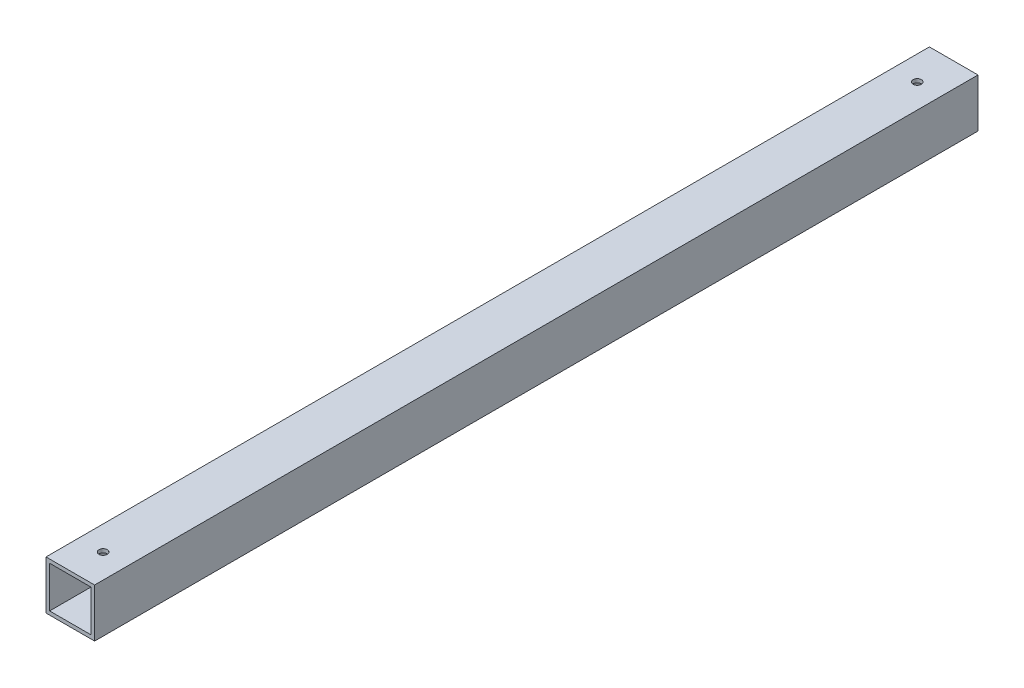
ISO-10303-21;
HEADER;
FILE_DESCRIPTION(('STEP AP214'),'2;1');
FILE_NAME('part.step','',(''),(''),'','','');
FILE_SCHEMA(('AUTOMOTIVE_DESIGN { 1 0 10303 214 1 1 1 1 }'));
ENDSEC;
DATA;
#1=APPLICATION_CONTEXT('core data for automotive mechanical design processes');
#2=APPLICATION_PROTOCOL_DEFINITION('international standard','automotive_design',2000,#1);
#3=PRODUCT_CONTEXT('',#1,'mechanical');
#4=PRODUCT('Part','Part','',(#3));
#5=PRODUCT_RELATED_PRODUCT_CATEGORY('part','',(#4));
#6=PRODUCT_DEFINITION_FORMATION('','',#4);
#7=PRODUCT_DEFINITION_CONTEXT('part definition',#1,'design');
#8=PRODUCT_DEFINITION('design','',#6,#7);
#9=PRODUCT_DEFINITION_SHAPE('','',#8);
#10=(LENGTH_UNIT() NAMED_UNIT(*) SI_UNIT(.MILLI.,.METRE.));
#11=(NAMED_UNIT(*) PLANE_ANGLE_UNIT() SI_UNIT($,.RADIAN.));
#12=(NAMED_UNIT(*) SI_UNIT($,.STERADIAN.) SOLID_ANGLE_UNIT());
#13=UNCERTAINTY_MEASURE_WITH_UNIT(LENGTH_MEASURE(1.E-05),#10,'distance_accuracy_value','');
#14=(GEOMETRIC_REPRESENTATION_CONTEXT(3) GLOBAL_UNCERTAINTY_ASSIGNED_CONTEXT((#13)) GLOBAL_UNIT_ASSIGNED_CONTEXT((#10,
#11,#12)) REPRESENTATION_CONTEXT('',''));
#15=CARTESIAN_POINT('',(0.,0.,0.));
#16=DIRECTION('',(0.,0.,1.));
#17=DIRECTION('',(1.,0.,0.));
#18=AXIS2_PLACEMENT_3D('',#15,#16,#17);
#19=CARTESIAN_POINT('',(0.,-20.,350.));
#20=DIRECTION('',(0.,1.,0.));
#21=DIRECTION('',(1.,0.,0.));
#22=AXIS2_PLACEMENT_3D('',#19,#20,#21);
#23=CYLINDRICAL_SURFACE('',#22,1.7);
#24=DIRECTION('',(0.,1.,0.));
#25=VECTOR('',#24,1.);
#26=CARTESIAN_POINT('',(1.7,-20.,350.));
#27=LINE('',#26,#25);
#28=CARTESIAN_POINT('',(1.7,8.5,350.));
#29=VERTEX_POINT('',#28);
#30=CARTESIAN_POINT('',(1.7,10.,350.));
#31=VERTEX_POINT('',#30);
#32=EDGE_CURVE('E9',#29,#31,#27,.T.);
#33=ORIENTED_EDGE('',*,*,#32,.F.);
#34=CARTESIAN_POINT('',(0.,8.5,350.));
#35=DIRECTION('',(0.,1.,0.));
#36=DIRECTION('',(1.,0.,0.));
#37=AXIS2_PLACEMENT_3D('',#34,#35,#36);
#38=CIRCLE('',#37,1.7);
#39=EDGE_CURVE('E193',#29,#29,#38,.T.);
#40=ORIENTED_EDGE('',*,*,#39,.F.);
#41=ORIENTED_EDGE('',*,*,#32,.T.);
#42=CARTESIAN_POINT('',(0.,10.,350.));
#43=DIRECTION('',(0.,1.,0.));
#44=DIRECTION('',(1.,0.,0.));
#45=AXIS2_PLACEMENT_3D('',#42,#43,#44);
#46=CIRCLE('',#45,1.7);
#47=EDGE_CURVE('E250',#31,#31,#46,.T.);
#48=ORIENTED_EDGE('',*,*,#47,.T.);
#49=EDGE_LOOP('',(#33,#40,#41,#48));
#50=FACE_BOUND('',#49,.T.);
#51=ADVANCED_FACE('F14',(#50),#23,.F.);
#52=CARTESIAN_POINT('',(0.,-20.,15.));
#53=DIRECTION('',(0.,1.,0.));
#54=DIRECTION('',(1.,0.,0.));
#55=AXIS2_PLACEMENT_3D('',#52,#53,#54);
#56=CYLINDRICAL_SURFACE('',#55,1.7);
#57=DIRECTION('',(0.,1.,0.));
#58=VECTOR('',#57,1.);
#59=CARTESIAN_POINT('',(1.7,-20.,15.));
#60=LINE('',#59,#58);
#61=CARTESIAN_POINT('',(1.7,8.5,15.));
#62=VERTEX_POINT('',#61);
#63=CARTESIAN_POINT('',(1.7,10.,15.));
#64=VERTEX_POINT('',#63);
#65=EDGE_CURVE('E25',#62,#64,#60,.T.);
#66=ORIENTED_EDGE('',*,*,#65,.F.);
#67=CARTESIAN_POINT('',(0.,8.5,15.));
#68=DIRECTION('',(0.,1.,0.));
#69=DIRECTION('',(1.,0.,0.));
#70=AXIS2_PLACEMENT_3D('',#67,#68,#69);
#71=CIRCLE('',#70,1.7);
#72=EDGE_CURVE('E200',#62,#62,#71,.T.);
#73=ORIENTED_EDGE('',*,*,#72,.F.);
#74=ORIENTED_EDGE('',*,*,#65,.T.);
#75=CARTESIAN_POINT('',(0.,10.,15.));
#76=DIRECTION('',(0.,1.,0.));
#77=DIRECTION('',(1.,0.,0.));
#78=AXIS2_PLACEMENT_3D('',#75,#76,#77);
#79=CIRCLE('',#78,1.7);
#80=EDGE_CURVE('E213',#64,#64,#79,.T.);
#81=ORIENTED_EDGE('',*,*,#80,.T.);
#82=EDGE_LOOP('',(#66,#73,#74,#81));
#83=FACE_BOUND('',#82,.T.);
#84=ADVANCED_FACE('F303',(#83),#56,.F.);
#85=CARTESIAN_POINT('',(-8.5,-8.5,-1.));
#86=DIRECTION('',(1.,0.,0.));
#87=DIRECTION('',(0.,1.,0.));
#88=AXIS2_PLACEMENT_3D('',#85,#86,#87);
#89=PLANE('',#88);
#90=DIRECTION('',(0.,0.,1.));
#91=VECTOR('',#90,1.);
#92=CARTESIAN_POINT('',(-8.5,-8.5,-1.));
#93=LINE('',#92,#91);
#94=CARTESIAN_POINT('',(-8.5,-8.5,0.));
#95=VERTEX_POINT('',#94);
#96=CARTESIAN_POINT('',(-8.5,-8.5,363.5));
#97=VERTEX_POINT('',#96);
#98=EDGE_CURVE('E157',#95,#97,#93,.T.);
#99=ORIENTED_EDGE('',*,*,#98,.F.);
#100=DIRECTION('',(0.,1.,0.));
#101=VECTOR('',#100,1.);
#102=CARTESIAN_POINT('',(-8.5,-9.25,0.));
#103=LINE('',#102,#101);
#104=CARTESIAN_POINT('',(-8.5,8.5,0.));
#105=VERTEX_POINT('',#104);
#106=EDGE_CURVE('E174',#95,#105,#103,.T.);
#107=ORIENTED_EDGE('',*,*,#106,.T.);
#108=DIRECTION('',(0.,0.,1.));
#109=VECTOR('',#108,1.);
#110=CARTESIAN_POINT('',(-8.5,8.5,-1.));
#111=LINE('',#110,#109);
#112=CARTESIAN_POINT('',(-8.5,8.5,363.5));
#113=VERTEX_POINT('',#112);
#114=EDGE_CURVE('E207',#105,#113,#111,.T.);
#115=ORIENTED_EDGE('',*,*,#114,.T.);
#116=DIRECTION('',(0.,1.,0.));
#117=VECTOR('',#116,1.);
#118=CARTESIAN_POINT('',(-8.5,-9.25,363.5));
#119=LINE('',#118,#117);
#120=EDGE_CURVE('E182',#97,#113,#119,.T.);
#121=ORIENTED_EDGE('',*,*,#120,.F.);
#122=EDGE_LOOP('',(#99,#107,#115,#121));
#123=FACE_BOUND('',#122,.T.);
#124=ADVANCED_FACE('F308',(#123),#89,.T.);
#125=CARTESIAN_POINT('',(-8.5,8.5,-1.));
#126=DIRECTION('',(0.,1.,0.));
#127=DIRECTION('',(1.,0.,0.));
#128=AXIS2_PLACEMENT_3D('',#125,#126,#127);
#129=PLANE('',#128);
#130=ORIENTED_EDGE('',*,*,#39,.T.);
#131=EDGE_LOOP('',(#130));
#132=FACE_BOUND('',#131,.T.);
#133=ORIENTED_EDGE('',*,*,#72,.T.);
#134=EDGE_LOOP('',(#133));
#135=FACE_BOUND('',#134,.T.);
#136=DIRECTION('',(-1.,0.,0.));
#137=VECTOR('',#136,1.);
#138=CARTESIAN_POINT('',(-9.25,8.5,363.5));
#139=LINE('',#138,#137);
#140=CARTESIAN_POINT('',(8.5,8.5,363.5));
#141=VERTEX_POINT('',#140);
#142=EDGE_CURVE('E169',#141,#113,#139,.T.);
#143=ORIENTED_EDGE('',*,*,#142,.T.);
#144=ORIENTED_EDGE('',*,*,#114,.F.);
#145=DIRECTION('',(-1.,0.,0.));
#146=VECTOR('',#145,1.);
#147=CARTESIAN_POINT('',(-9.25,8.5,0.));
#148=LINE('',#147,#146);
#149=CARTESIAN_POINT('',(8.5,8.5,0.));
#150=VERTEX_POINT('',#149);
#151=EDGE_CURVE('E235',#150,#105,#148,.T.);
#152=ORIENTED_EDGE('',*,*,#151,.F.);
#153=DIRECTION('',(0.,0.,1.));
#154=VECTOR('',#153,1.);
#155=CARTESIAN_POINT('',(8.5,8.5,-1.));
#156=LINE('',#155,#154);
#157=EDGE_CURVE('E177',#150,#141,#156,.T.);
#158=ORIENTED_EDGE('',*,*,#157,.T.);
#159=EDGE_LOOP('',(#143,#144,#152,#158));
#160=FACE_BOUND('',#159,.T.);
#161=ADVANCED_FACE('F315',(#132,#135,#160),#129,.F.);
#162=CARTESIAN_POINT('',(8.5,-8.5,-1.));
#163=DIRECTION('',(1.,0.,0.));
#164=DIRECTION('',(0.,1.,0.));
#165=AXIS2_PLACEMENT_3D('',#162,#163,#164);
#166=PLANE('',#165);
#167=DIRECTION('',(0.,1.,0.));
#168=VECTOR('',#167,1.);
#169=CARTESIAN_POINT('',(8.5,-9.25,363.5));
#170=LINE('',#169,#168);
#171=CARTESIAN_POINT('',(8.5,-8.5,363.5));
#172=VERTEX_POINT('',#171);
#173=EDGE_CURVE('E164',#172,#141,#170,.T.);
#174=ORIENTED_EDGE('',*,*,#173,.T.);
#175=ORIENTED_EDGE('',*,*,#157,.F.);
#176=DIRECTION('',(0.,1.,0.));
#177=VECTOR('',#176,1.);
#178=CARTESIAN_POINT('',(8.5,-9.25,0.));
#179=LINE('',#178,#177);
#180=CARTESIAN_POINT('',(8.5,-8.5,0.));
#181=VERTEX_POINT('',#180);
#182=EDGE_CURVE('E162',#181,#150,#179,.T.);
#183=ORIENTED_EDGE('',*,*,#182,.F.);
#184=DIRECTION('',(0.,0.,1.));
#185=VECTOR('',#184,1.);
#186=CARTESIAN_POINT('',(8.5,-8.5,-1.));
#187=LINE('',#186,#185);
#188=EDGE_CURVE('E150',#181,#172,#187,.T.);
#189=ORIENTED_EDGE('',*,*,#188,.T.);
#190=EDGE_LOOP('',(#174,#175,#183,#189));
#191=FACE_BOUND('',#190,.T.);
#192=ADVANCED_FACE('F318',(#191),#166,.F.);
#193=CARTESIAN_POINT('',(-8.5,-8.5,-1.));
#194=DIRECTION('',(0.,1.,0.));
#195=DIRECTION('',(1.,0.,0.));
#196=AXIS2_PLACEMENT_3D('',#193,#194,#195);
#197=PLANE('',#196);
#198=CARTESIAN_POINT('',(0.,-8.5,350.));
#199=DIRECTION('',(0.,1.,0.));
#200=DIRECTION('',(1.,0.,0.));
#201=AXIS2_PLACEMENT_3D('',#198,#199,#200);
#202=CIRCLE('',#201,1.7);
#203=CARTESIAN_POINT('',(1.7,-8.5,350.));
#204=VERTEX_POINT('',#203);
#205=EDGE_CURVE('E143',#204,#204,#202,.T.);
#206=ORIENTED_EDGE('',*,*,#205,.F.);
#207=EDGE_LOOP('',(#206));
#208=FACE_BOUND('',#207,.T.);
#209=CARTESIAN_POINT('',(0.,-8.5,15.));
#210=DIRECTION('',(0.,1.,0.));
#211=DIRECTION('',(1.,0.,0.));
#212=AXIS2_PLACEMENT_3D('',#209,#210,#211);
#213=CIRCLE('',#212,1.7);
#214=CARTESIAN_POINT('',(1.7,-8.5,15.));
#215=VERTEX_POINT('',#214);
#216=EDGE_CURVE('E137',#215,#215,#213,.T.);
#217=ORIENTED_EDGE('',*,*,#216,.F.);
#218=EDGE_LOOP('',(#217));
#219=FACE_BOUND('',#218,.T.);
#220=ORIENTED_EDGE('',*,*,#188,.F.);
#221=DIRECTION('',(-1.,0.,0.));
#222=VECTOR('',#221,1.);
#223=CARTESIAN_POINT('',(-9.25,-8.5,0.));
#224=LINE('',#223,#222);
#225=EDGE_CURVE('E170',#181,#95,#224,.T.);
#226=ORIENTED_EDGE('',*,*,#225,.T.);
#227=ORIENTED_EDGE('',*,*,#98,.T.);
#228=DIRECTION('',(-1.,0.,0.));
#229=VECTOR('',#228,1.);
#230=CARTESIAN_POINT('',(-9.25,-8.5,363.5));
#231=LINE('',#230,#229);
#232=EDGE_CURVE('E186',#172,#97,#231,.T.);
#233=ORIENTED_EDGE('',*,*,#232,.F.);
#234=EDGE_LOOP('',(#220,#226,#227,#233));
#235=FACE_BOUND('',#234,.T.);
#236=ADVANCED_FACE('F314',(#208,#219,#235),#197,.T.);
#237=CARTESIAN_POINT('',(0.,-20.,350.));
#238=DIRECTION('',(0.,1.,0.));
#239=DIRECTION('',(1.,0.,0.));
#240=AXIS2_PLACEMENT_3D('',#237,#238,#239);
#241=CYLINDRICAL_SURFACE('',#240,1.7);
#242=DIRECTION('',(0.,1.,0.));
#243=VECTOR('',#242,1.);
#244=CARTESIAN_POINT('',(1.7,-20.,350.));
#245=LINE('',#244,#243);
#246=CARTESIAN_POINT('',(1.7,-10.,350.));
#247=VERTEX_POINT('',#246);
#248=EDGE_CURVE('E146',#247,#204,#245,.T.);
#249=ORIENTED_EDGE('',*,*,#248,.F.);
#250=CARTESIAN_POINT('',(0.,-10.,350.));
#251=DIRECTION('',(0.,1.,0.));
#252=DIRECTION('',(1.,0.,0.));
#253=AXIS2_PLACEMENT_3D('',#250,#251,#252);
#254=CIRCLE('',#253,1.7);
#255=EDGE_CURVE('E222',#247,#247,#254,.T.);
#256=ORIENTED_EDGE('',*,*,#255,.F.);
#257=ORIENTED_EDGE('',*,*,#248,.T.);
#258=ORIENTED_EDGE('',*,*,#205,.T.);
#259=EDGE_LOOP('',(#249,#256,#257,#258));
#260=FACE_BOUND('',#259,.T.);
#261=ADVANCED_FACE('F144',(#260),#241,.F.);
#262=CARTESIAN_POINT('',(0.,-20.,15.));
#263=DIRECTION('',(0.,1.,0.));
#264=DIRECTION('',(1.,0.,0.));
#265=AXIS2_PLACEMENT_3D('',#262,#263,#264);
#266=CYLINDRICAL_SURFACE('',#265,1.7);
#267=DIRECTION('',(0.,1.,0.));
#268=VECTOR('',#267,1.);
#269=CARTESIAN_POINT('',(1.7,-20.,15.));
#270=LINE('',#269,#268);
#271=CARTESIAN_POINT('',(1.7,-10.,15.));
#272=VERTEX_POINT('',#271);
#273=EDGE_CURVE('E126',#272,#215,#270,.T.);
#274=ORIENTED_EDGE('',*,*,#273,.F.);
#275=CARTESIAN_POINT('',(0.,-10.,15.));
#276=DIRECTION('',(0.,1.,0.));
#277=DIRECTION('',(1.,0.,0.));
#278=AXIS2_PLACEMENT_3D('',#275,#276,#277);
#279=CIRCLE('',#278,1.7);
#280=EDGE_CURVE('E225',#272,#272,#279,.T.);
#281=ORIENTED_EDGE('',*,*,#280,.F.);
#282=ORIENTED_EDGE('',*,*,#273,.T.);
#283=ORIENTED_EDGE('',*,*,#216,.T.);
#284=EDGE_LOOP('',(#274,#281,#282,#283));
#285=FACE_BOUND('',#284,.T.);
#286=ADVANCED_FACE('F313',(#285),#266,.F.);
#287=CARTESIAN_POINT('',(10.,-10.,0.));
#288=DIRECTION('',(1.,0.,0.));
#289=DIRECTION('',(0.,1.,0.));
#290=AXIS2_PLACEMENT_3D('',#287,#288,#289);
#291=PLANE('',#290);
#292=DIRECTION('',(0.,0.,1.));
#293=VECTOR('',#292,1.);
#294=CARTESIAN_POINT('',(10.,-10.,0.));
#295=LINE('',#294,#293);
#296=CARTESIAN_POINT('',(10.,-10.,0.));
#297=VERTEX_POINT('',#296);
#298=CARTESIAN_POINT('',(10.,-10.,363.5));
#299=VERTEX_POINT('',#298);
#300=EDGE_CURVE('E190',#297,#299,#295,.T.);
#301=ORIENTED_EDGE('',*,*,#300,.F.);
#302=DIRECTION('',(0.,1.,0.));
#303=VECTOR('',#302,1.);
#304=CARTESIAN_POINT('',(10.,-10.,0.));
#305=LINE('',#304,#303);
#306=CARTESIAN_POINT('',(10.,10.,0.));
#307=VERTEX_POINT('',#306);
#308=EDGE_CURVE('E253',#297,#307,#305,.T.);
#309=ORIENTED_EDGE('',*,*,#308,.T.);
#310=DIRECTION('',(0.,0.,1.));
#311=VECTOR('',#310,1.);
#312=CARTESIAN_POINT('',(10.,10.,0.));
#313=LINE('',#312,#311);
#314=CARTESIAN_POINT('',(10.,10.,363.5));
#315=VERTEX_POINT('',#314);
#316=EDGE_CURVE('E181',#307,#315,#313,.T.);
#317=ORIENTED_EDGE('',*,*,#316,.T.);
#318=DIRECTION('',(0.,1.,0.));
#319=VECTOR('',#318,1.);
#320=CARTESIAN_POINT('',(10.,-10.,363.5));
#321=LINE('',#320,#319);
#322=EDGE_CURVE('E114',#299,#315,#321,.T.);
#323=ORIENTED_EDGE('',*,*,#322,.F.);
#324=EDGE_LOOP('',(#301,#309,#317,#323));
#325=FACE_BOUND('',#324,.T.);
#326=ADVANCED_FACE('F279',(#325),#291,.T.);
#327=CARTESIAN_POINT('',(-10.,-10.,0.));
#328=DIRECTION('',(0.,0.,1.));
#329=DIRECTION('',(1.,0.,0.));
#330=AXIS2_PLACEMENT_3D('',#327,#328,#329);
#331=PLANE('',#330);
#332=ORIENTED_EDGE('',*,*,#182,.T.);
#333=ORIENTED_EDGE('',*,*,#151,.T.);
#334=ORIENTED_EDGE('',*,*,#106,.F.);
#335=ORIENTED_EDGE('',*,*,#225,.F.);
#336=EDGE_LOOP('',(#332,#333,#334,#335));
#337=FACE_BOUND('',#336,.T.);
#338=DIRECTION('',(1.,0.,0.));
#339=VECTOR('',#338,1.);
#340=CARTESIAN_POINT('',(-10.,10.,0.));
#341=LINE('',#340,#339);
#342=CARTESIAN_POINT('',(-10.,10.,0.));
#343=VERTEX_POINT('',#342);
#344=EDGE_CURVE('E168',#343,#307,#341,.T.);
#345=ORIENTED_EDGE('',*,*,#344,.T.);
#346=ORIENTED_EDGE('',*,*,#308,.F.);
#347=DIRECTION('',(1.,0.,0.));
#348=VECTOR('',#347,1.);
#349=CARTESIAN_POINT('',(-10.,-10.,0.));
#350=LINE('',#349,#348);
#351=CARTESIAN_POINT('',(-10.,-10.,0.));
#352=VERTEX_POINT('',#351);
#353=EDGE_CURVE('E18',#352,#297,#350,.T.);
#354=ORIENTED_EDGE('',*,*,#353,.F.);
#355=DIRECTION('',(0.,1.,0.));
#356=VECTOR('',#355,1.);
#357=CARTESIAN_POINT('',(-10.,-10.,0.));
#358=LINE('',#357,#356);
#359=EDGE_CURVE('E191',#352,#343,#358,.T.);
#360=ORIENTED_EDGE('',*,*,#359,.T.);
#361=EDGE_LOOP('',(#345,#346,#354,#360));
#362=FACE_BOUND('',#361,.T.);
#363=ADVANCED_FACE('F283',(#337,#362),#331,.F.);
#364=CARTESIAN_POINT('',(-10.,10.,0.));
#365=DIRECTION('',(0.,1.,0.));
#366=DIRECTION('',(1.,0.,0.));
#367=AXIS2_PLACEMENT_3D('',#364,#365,#366);
#368=PLANE('',#367);
#369=ORIENTED_EDGE('',*,*,#47,.F.);
#370=EDGE_LOOP('',(#369));
#371=FACE_BOUND('',#370,.T.);
#372=ORIENTED_EDGE('',*,*,#80,.F.);
#373=EDGE_LOOP('',(#372));
#374=FACE_BOUND('',#373,.T.);
#375=ORIENTED_EDGE('',*,*,#344,.F.);
#376=DIRECTION('',(0.,0.,1.));
#377=VECTOR('',#376,1.);
#378=CARTESIAN_POINT('',(-10.,10.,0.));
#379=LINE('',#378,#377);
#380=CARTESIAN_POINT('',(-10.,10.,363.5));
#381=VERTEX_POINT('',#380);
#382=EDGE_CURVE('E216',#343,#381,#379,.T.);
#383=ORIENTED_EDGE('',*,*,#382,.T.);
#384=DIRECTION('',(1.,0.,0.));
#385=VECTOR('',#384,1.);
#386=CARTESIAN_POINT('',(-10.,10.,363.5));
#387=LINE('',#386,#385);
#388=EDGE_CURVE('E244',#381,#315,#387,.T.);
#389=ORIENTED_EDGE('',*,*,#388,.T.);
#390=ORIENTED_EDGE('',*,*,#316,.F.);
#391=EDGE_LOOP('',(#375,#383,#389,#390));
#392=FACE_BOUND('',#391,.T.);
#393=ADVANCED_FACE('F16',(#371,#374,#392),#368,.T.);
#394=CARTESIAN_POINT('',(-10.,-10.,363.5));
#395=DIRECTION('',(0.,0.,1.));
#396=DIRECTION('',(1.,0.,0.));
#397=AXIS2_PLACEMENT_3D('',#394,#395,#396);
#398=PLANE('',#397);
#399=ORIENTED_EDGE('',*,*,#232,.T.);
#400=ORIENTED_EDGE('',*,*,#120,.T.);
#401=ORIENTED_EDGE('',*,*,#142,.F.);
#402=ORIENTED_EDGE('',*,*,#173,.F.);
#403=EDGE_LOOP('',(#399,#400,#401,#402));
#404=FACE_BOUND('',#403,.T.);
#405=DIRECTION('',(0.,1.,0.));
#406=VECTOR('',#405,1.);
#407=CARTESIAN_POINT('',(-10.,-10.,363.5));
#408=LINE('',#407,#406);
#409=CARTESIAN_POINT('',(-10.,-10.,363.5));
#410=VERTEX_POINT('',#409);
#411=EDGE_CURVE('E231',#410,#381,#408,.T.);
#412=ORIENTED_EDGE('',*,*,#411,.F.);
#413=DIRECTION('',(1.,0.,0.));
#414=VECTOR('',#413,1.);
#415=CARTESIAN_POINT('',(-10.,-10.,363.5));
#416=LINE('',#415,#414);
#417=EDGE_CURVE('E221',#410,#299,#416,.T.);
#418=ORIENTED_EDGE('',*,*,#417,.T.);
#419=ORIENTED_EDGE('',*,*,#322,.T.);
#420=ORIENTED_EDGE('',*,*,#388,.F.);
#421=EDGE_LOOP('',(#412,#418,#419,#420));
#422=FACE_BOUND('',#421,.T.);
#423=ADVANCED_FACE('F287',(#404,#422),#398,.T.);
#424=CARTESIAN_POINT('',(-10.,-10.,0.));
#425=DIRECTION('',(0.,1.,0.));
#426=DIRECTION('',(1.,0.,0.));
#427=AXIS2_PLACEMENT_3D('',#424,#425,#426);
#428=PLANE('',#427);
#429=ORIENTED_EDGE('',*,*,#255,.T.);
#430=EDGE_LOOP('',(#429));
#431=FACE_BOUND('',#430,.T.);
#432=ORIENTED_EDGE('',*,*,#280,.T.);
#433=EDGE_LOOP('',(#432));
#434=FACE_BOUND('',#433,.T.);
#435=ORIENTED_EDGE('',*,*,#300,.T.);
#436=ORIENTED_EDGE('',*,*,#417,.F.);
#437=DIRECTION('',(0.,0.,1.));
#438=VECTOR('',#437,1.);
#439=CARTESIAN_POINT('',(-10.,-10.,0.));
#440=LINE('',#439,#438);
#441=EDGE_CURVE('E187',#352,#410,#440,.T.);
#442=ORIENTED_EDGE('',*,*,#441,.F.);
#443=ORIENTED_EDGE('',*,*,#353,.T.);
#444=EDGE_LOOP('',(#435,#436,#442,#443));
#445=FACE_BOUND('',#444,.T.);
#446=ADVANCED_FACE('F275',(#431,#434,#445),#428,.F.);
#447=CARTESIAN_POINT('',(-10.,-10.,0.));
#448=DIRECTION('',(1.,0.,0.));
#449=DIRECTION('',(0.,1.,0.));
#450=AXIS2_PLACEMENT_3D('',#447,#448,#449);
#451=PLANE('',#450);
#452=ORIENTED_EDGE('',*,*,#411,.T.);
#453=ORIENTED_EDGE('',*,*,#382,.F.);
#454=ORIENTED_EDGE('',*,*,#359,.F.);
#455=ORIENTED_EDGE('',*,*,#441,.T.);
#456=EDGE_LOOP('',(#452,#453,#454,#455));
#457=FACE_BOUND('',#456,.T.);
#458=ADVANCED_FACE('F286',(#457),#451,.F.);
#459=CLOSED_SHELL('',(#51,#84,#124,#161,#192,#236,#261,#286,#326,#363,#393,#423,#446,#458));
#460=MANIFOLD_SOLID_BREP('B1',#459);
#461=ADVANCED_BREP_SHAPE_REPRESENTATION('',(#18,#460),#14);
#462=SHAPE_DEFINITION_REPRESENTATION(#9,#461);
ENDSEC;
END-ISO-10303-21;
